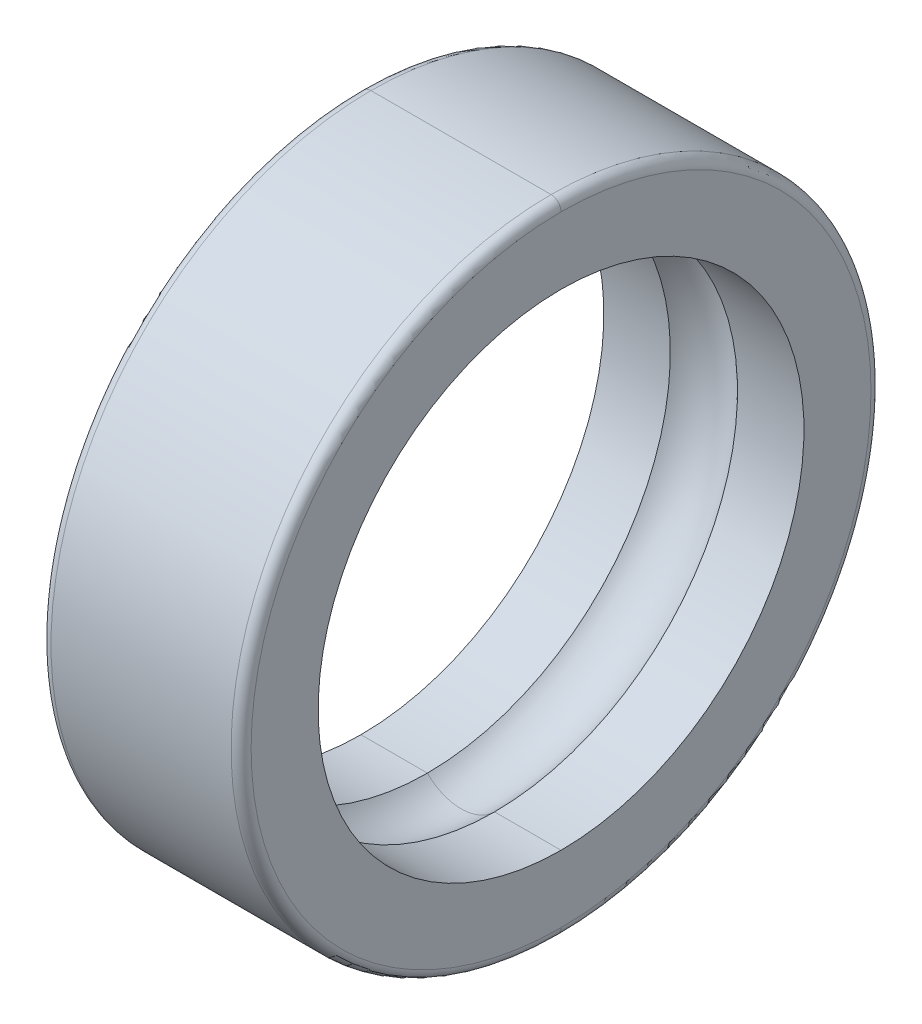
ISO-10303-21;
HEADER;
FILE_DESCRIPTION(('STEP AP214'),'2;1');
FILE_NAME('part.step','',(''),(''),'','','');
FILE_SCHEMA(('AUTOMOTIVE_DESIGN { 1 0 10303 214 1 1 1 1 }'));
ENDSEC;
DATA;
#1=APPLICATION_CONTEXT('core data for automotive mechanical design processes');
#2=APPLICATION_PROTOCOL_DEFINITION('international standard','automotive_design',2000,#1);
#3=PRODUCT_CONTEXT('',#1,'mechanical');
#4=PRODUCT('Part','Part','',(#3));
#5=PRODUCT_RELATED_PRODUCT_CATEGORY('part','',(#4));
#6=PRODUCT_DEFINITION_FORMATION('','',#4);
#7=PRODUCT_DEFINITION_CONTEXT('part definition',#1,'design');
#8=PRODUCT_DEFINITION('design','',#6,#7);
#9=PRODUCT_DEFINITION_SHAPE('','',#8);
#10=(LENGTH_UNIT() NAMED_UNIT(*) SI_UNIT(.MILLI.,.METRE.));
#11=(NAMED_UNIT(*) PLANE_ANGLE_UNIT() SI_UNIT($,.RADIAN.));
#12=(NAMED_UNIT(*) SI_UNIT($,.STERADIAN.) SOLID_ANGLE_UNIT());
#13=UNCERTAINTY_MEASURE_WITH_UNIT(LENGTH_MEASURE(1.E-05),#10,'distance_accuracy_value','');
#14=(GEOMETRIC_REPRESENTATION_CONTEXT(3) GLOBAL_UNCERTAINTY_ASSIGNED_CONTEXT((#13)) GLOBAL_UNIT_ASSIGNED_CONTEXT((#10,
#11,#12)) REPRESENTATION_CONTEXT('',''));
#15=CARTESIAN_POINT('',(0.,0.,0.));
#16=DIRECTION('',(0.,0.,1.));
#17=DIRECTION('',(1.,0.,0.));
#18=AXIS2_PLACEMENT_3D('',#15,#16,#17);
#19=CARTESIAN_POINT('',(-2.75209,0.,0.));
#20=DIRECTION('',(1.,0.,0.));
#21=DIRECTION('',(0.,-1.,0.));
#22=AXIS2_PLACEMENT_3D('',#19,#20,#21);
#23=CYLINDRICAL_SURFACE('',#22,6.0745751);
#24=CARTESIAN_POINT('',(2.5019,0.,0.));
#25=DIRECTION('',(1.,0.,0.));
#26=DIRECTION('',(0.,1.,0.));
#27=AXIS2_PLACEMENT_3D('',#24,#25,#26);
#28=CIRCLE('',#27,6.0745751);
#29=CARTESIAN_POINT('',(2.5019,6.0745751,0.));
#30=VERTEX_POINT('',#29);
#31=CARTESIAN_POINT('',(2.5019,-6.0745751,0.));
#32=VERTEX_POINT('',#31);
#33=EDGE_CURVE('E98',#30,#32,#28,.T.);
#34=ORIENTED_EDGE('',*,*,#33,.T.);
#35=DIRECTION('',(1.,0.,0.));
#36=VECTOR('',#35,1.);
#37=CARTESIAN_POINT('',(0.839755569912454,-6.0745751,0.));
#38=LINE('',#37,#36);
#39=CARTESIAN_POINT('',(0.839755569912454,-6.0745751,0.));
#40=VERTEX_POINT('',#39);
#41=EDGE_CURVE('E11',#40,#32,#38,.T.);
#42=ORIENTED_EDGE('',*,*,#41,.F.);
#43=CARTESIAN_POINT('',(0.839755569912455,0.,0.));
#44=DIRECTION('',(1.,0.,0.));
#45=DIRECTION('',(0.,1.,0.));
#46=AXIS2_PLACEMENT_3D('',#43,#44,#45);
#47=CIRCLE('',#46,6.0745751);
#48=CARTESIAN_POINT('',(0.839755569912454,6.0745751,0.));
#49=VERTEX_POINT('',#48);
#50=EDGE_CURVE('E20',#49,#40,#47,.T.);
#51=ORIENTED_EDGE('',*,*,#50,.F.);
#52=DIRECTION('',(1.,0.,0.));
#53=VECTOR('',#52,1.);
#54=CARTESIAN_POINT('',(0.839755569912454,6.0745751,0.));
#55=LINE('',#54,#53);
#56=EDGE_CURVE('E25',#49,#30,#55,.T.);
#57=ORIENTED_EDGE('',*,*,#56,.T.);
#58=EDGE_LOOP('',(#34,#42,#51,#57));
#59=FACE_BOUND('',#58,.T.);
#60=ADVANCED_FACE('F17',(#59),#23,.F.);
#61=CARTESIAN_POINT('',(-2.75209,0.,0.));
#62=DIRECTION('',(1.,0.,0.));
#63=DIRECTION('',(0.,-1.,0.));
#64=AXIS2_PLACEMENT_3D('',#61,#62,#63);
#65=CYLINDRICAL_SURFACE('',#64,6.0745751);
#66=CARTESIAN_POINT('',(0.839755569912455,0.,0.));
#67=DIRECTION('',(-1.,0.,0.));
#68=DIRECTION('',(0.,1.,0.));
#69=AXIS2_PLACEMENT_3D('',#66,#67,#68);
#70=CIRCLE('',#69,6.0745751);
#71=EDGE_CURVE('E94',#49,#40,#70,.T.);
#72=ORIENTED_EDGE('',*,*,#71,.T.);
#73=ORIENTED_EDGE('',*,*,#41,.T.);
#74=CARTESIAN_POINT('',(2.5019,0.,0.));
#75=DIRECTION('',(-1.,0.,0.));
#76=DIRECTION('',(0.,1.,0.));
#77=AXIS2_PLACEMENT_3D('',#74,#75,#76);
#78=CIRCLE('',#77,6.0745751);
#79=EDGE_CURVE('E96',#30,#32,#78,.T.);
#80=ORIENTED_EDGE('',*,*,#79,.F.);
#81=ORIENTED_EDGE('',*,*,#56,.F.);
#82=EDGE_LOOP('',(#72,#73,#80,#81));
#83=FACE_BOUND('',#82,.T.);
#84=ADVANCED_FACE('F92',(#83),#65,.F.);
#85=CARTESIAN_POINT('',(2.5019,0.,0.));
#86=DIRECTION('',(1.,0.,0.));
#87=DIRECTION('',(0.,-1.,0.));
#88=AXIS2_PLACEMENT_3D('',#85,#86,#87);
#89=PLANE('',#88);
#90=ORIENTED_EDGE('',*,*,#33,.F.);
#91=ORIENTED_EDGE('',*,*,#79,.T.);
#92=EDGE_LOOP('',(#90,#91));
#93=FACE_BOUND('',#92,.T.);
#94=CARTESIAN_POINT('',(2.5019,0.,0.));
#95=DIRECTION('',(-1.,0.,0.));
#96=DIRECTION('',(0.,1.,0.));
#97=AXIS2_PLACEMENT_3D('',#94,#95,#96);
#98=CIRCLE('',#97,7.75081);
#99=CARTESIAN_POINT('',(2.5019,7.75081,0.));
#100=VERTEX_POINT('',#99);
#101=CARTESIAN_POINT('',(2.5019,-7.75081,0.));
#102=VERTEX_POINT('',#101);
#103=EDGE_CURVE('E116',#100,#102,#98,.T.);
#104=ORIENTED_EDGE('',*,*,#103,.F.);
#105=CARTESIAN_POINT('',(2.5019,0.,0.));
#106=DIRECTION('',(1.,0.,0.));
#107=DIRECTION('',(0.,1.,0.));
#108=AXIS2_PLACEMENT_3D('',#105,#106,#107);
#109=CIRCLE('',#108,7.75081);
#110=EDGE_CURVE('E114',#100,#102,#109,.T.);
#111=ORIENTED_EDGE('',*,*,#110,.T.);
#112=EDGE_LOOP('',(#104,#111));
#113=FACE_BOUND('',#112,.T.);
#114=ADVANCED_FACE('F175',(#93,#113),#89,.T.);
#115=CARTESIAN_POINT('',(2.25171,0.,0.));
#116=DIRECTION('',(1.,0.,0.));
#117=DIRECTION('',(0.,-1.,0.));
#118=AXIS2_PLACEMENT_3D('',#115,#116,#117);
#119=TOROIDAL_SURFACE('',#118,7.75081,0.25019);
#120=CARTESIAN_POINT('',(2.25171,0.,0.));
#121=DIRECTION('',(1.,0.,0.));
#122=DIRECTION('',(0.,1.,0.));
#123=AXIS2_PLACEMENT_3D('',#120,#121,#122);
#124=CIRCLE('',#123,8.001);
#125=CARTESIAN_POINT('',(2.25171,8.001,0.));
#126=VERTEX_POINT('',#125);
#127=CARTESIAN_POINT('',(2.25171,-8.001,0.));
#128=VERTEX_POINT('',#127);
#129=EDGE_CURVE('E129',#126,#128,#124,.T.);
#130=ORIENTED_EDGE('',*,*,#129,.T.);
#131=CARTESIAN_POINT('',(2.25171,-7.75081,0.));
#132=DIRECTION('',(0.,0.,-1.));
#133=DIRECTION('',(1.,0.,0.));
#134=AXIS2_PLACEMENT_3D('',#131,#132,#133);
#135=CIRCLE('',#134,0.25019);
#136=EDGE_CURVE('E119',#102,#128,#135,.T.);
#137=ORIENTED_EDGE('',*,*,#136,.F.);
#138=ORIENTED_EDGE('',*,*,#110,.F.);
#139=CARTESIAN_POINT('',(2.25171,7.75081,0.));
#140=DIRECTION('',(0.,0.,1.));
#141=DIRECTION('',(1.,0.,0.));
#142=AXIS2_PLACEMENT_3D('',#139,#140,#141);
#143=CIRCLE('',#142,0.25019);
#144=EDGE_CURVE('E122',#100,#126,#143,.T.);
#145=ORIENTED_EDGE('',*,*,#144,.T.);
#146=EDGE_LOOP('',(#130,#137,#138,#145));
#147=FACE_BOUND('',#146,.T.);
#148=ADVANCED_FACE('F179',(#147),#119,.T.);
#149=CARTESIAN_POINT('',(2.25171,0.,0.));
#150=DIRECTION('',(1.,0.,0.));
#151=DIRECTION('',(0.,-1.,0.));
#152=AXIS2_PLACEMENT_3D('',#149,#150,#151);
#153=TOROIDAL_SURFACE('',#152,7.75081,0.25019);
#154=ORIENTED_EDGE('',*,*,#103,.T.);
#155=ORIENTED_EDGE('',*,*,#136,.T.);
#156=CARTESIAN_POINT('',(2.25171,0.,0.));
#157=DIRECTION('',(-1.,0.,0.));
#158=DIRECTION('',(0.,1.,0.));
#159=AXIS2_PLACEMENT_3D('',#156,#157,#158);
#160=CIRCLE('',#159,8.001);
#161=EDGE_CURVE('E124',#126,#128,#160,.T.);
#162=ORIENTED_EDGE('',*,*,#161,.F.);
#163=ORIENTED_EDGE('',*,*,#144,.F.);
#164=EDGE_LOOP('',(#154,#155,#162,#163));
#165=FACE_BOUND('',#164,.T.);
#166=ADVANCED_FACE('F185',(#165),#153,.T.);
#167=CARTESIAN_POINT('',(-2.75209,0.,0.));
#168=DIRECTION('',(1.,0.,0.));
#169=DIRECTION('',(0.,-1.,0.));
#170=AXIS2_PLACEMENT_3D('',#167,#168,#169);
#171=CYLINDRICAL_SURFACE('',#170,8.001);
#172=ORIENTED_EDGE('',*,*,#161,.T.);
#173=DIRECTION('',(-1.,0.,0.));
#174=VECTOR('',#173,1.);
#175=CARTESIAN_POINT('',(2.25171,-8.001,0.));
#176=LINE('',#175,#174);
#177=CARTESIAN_POINT('',(-2.25171,-8.001,0.));
#178=VERTEX_POINT('',#177);
#179=EDGE_CURVE('E127',#128,#178,#176,.T.);
#180=ORIENTED_EDGE('',*,*,#179,.T.);
#181=CARTESIAN_POINT('',(-2.25171,0.,0.));
#182=DIRECTION('',(-1.,0.,0.));
#183=DIRECTION('',(0.,1.,0.));
#184=AXIS2_PLACEMENT_3D('',#181,#182,#183);
#185=CIRCLE('',#184,8.001);
#186=CARTESIAN_POINT('',(-2.25171,8.001,0.));
#187=VERTEX_POINT('',#186);
#188=EDGE_CURVE('E137',#187,#178,#185,.T.);
#189=ORIENTED_EDGE('',*,*,#188,.F.);
#190=DIRECTION('',(-1.,0.,0.));
#191=VECTOR('',#190,1.);
#192=CARTESIAN_POINT('',(2.25171,8.001,0.));
#193=LINE('',#192,#191);
#194=EDGE_CURVE('E130',#126,#187,#193,.T.);
#195=ORIENTED_EDGE('',*,*,#194,.F.);
#196=EDGE_LOOP('',(#172,#180,#189,#195));
#197=FACE_BOUND('',#196,.T.);
#198=ADVANCED_FACE('F189',(#197),#171,.T.);
#199=CARTESIAN_POINT('',(-2.75209,0.,0.));
#200=DIRECTION('',(1.,0.,0.));
#201=DIRECTION('',(0.,-1.,0.));
#202=AXIS2_PLACEMENT_3D('',#199,#200,#201);
#203=CYLINDRICAL_SURFACE('',#202,8.001);
#204=CARTESIAN_POINT('',(-2.25171,0.,0.));
#205=DIRECTION('',(1.,0.,0.));
#206=DIRECTION('',(0.,1.,0.));
#207=AXIS2_PLACEMENT_3D('',#204,#205,#206);
#208=CIRCLE('',#207,8.001);
#209=EDGE_CURVE('E133',#187,#178,#208,.T.);
#210=ORIENTED_EDGE('',*,*,#209,.T.);
#211=ORIENTED_EDGE('',*,*,#179,.F.);
#212=ORIENTED_EDGE('',*,*,#129,.F.);
#213=ORIENTED_EDGE('',*,*,#194,.T.);
#214=EDGE_LOOP('',(#210,#211,#212,#213));
#215=FACE_BOUND('',#214,.T.);
#216=ADVANCED_FACE('F193',(#215),#203,.T.);
#217=CARTESIAN_POINT('',(-2.25171,0.,0.));
#218=DIRECTION('',(1.,0.,0.));
#219=DIRECTION('',(0.,-1.,0.));
#220=AXIS2_PLACEMENT_3D('',#217,#218,#219);
#221=TOROIDAL_SURFACE('',#220,7.75081,0.25019);
#222=CARTESIAN_POINT('',(-2.5019,0.,0.));
#223=DIRECTION('',(1.,0.,0.));
#224=DIRECTION('',(0.,1.,0.));
#225=AXIS2_PLACEMENT_3D('',#222,#223,#224);
#226=CIRCLE('',#225,7.75081);
#227=CARTESIAN_POINT('',(-2.5019,7.75081,0.));
#228=VERTEX_POINT('',#227);
#229=CARTESIAN_POINT('',(-2.5019,-7.75081,0.));
#230=VERTEX_POINT('',#229);
#231=EDGE_CURVE('E145',#228,#230,#226,.T.);
#232=ORIENTED_EDGE('',*,*,#231,.T.);
#233=CARTESIAN_POINT('',(-2.25171,-7.75081,0.));
#234=DIRECTION('',(0.,0.,-1.));
#235=DIRECTION('',(0.,-1.,0.));
#236=AXIS2_PLACEMENT_3D('',#233,#234,#235);
#237=CIRCLE('',#236,0.25019);
#238=EDGE_CURVE('E140',#178,#230,#237,.T.);
#239=ORIENTED_EDGE('',*,*,#238,.F.);
#240=ORIENTED_EDGE('',*,*,#209,.F.);
#241=CARTESIAN_POINT('',(-2.25171,7.75081,0.));
#242=DIRECTION('',(0.,0.,1.));
#243=DIRECTION('',(0.,1.,0.));
#244=AXIS2_PLACEMENT_3D('',#241,#242,#243);
#245=CIRCLE('',#244,0.25019);
#246=EDGE_CURVE('E143',#187,#228,#245,.T.);
#247=ORIENTED_EDGE('',*,*,#246,.T.);
#248=EDGE_LOOP('',(#232,#239,#240,#247));
#249=FACE_BOUND('',#248,.T.);
#250=ADVANCED_FACE('F197',(#249),#221,.T.);
#251=CARTESIAN_POINT('',(-2.25171,0.,0.));
#252=DIRECTION('',(1.,0.,0.));
#253=DIRECTION('',(0.,-1.,0.));
#254=AXIS2_PLACEMENT_3D('',#251,#252,#253);
#255=TOROIDAL_SURFACE('',#254,7.75081,0.25019);
#256=ORIENTED_EDGE('',*,*,#188,.T.);
#257=ORIENTED_EDGE('',*,*,#238,.T.);
#258=CARTESIAN_POINT('',(-2.5019,0.,0.));
#259=DIRECTION('',(-1.,0.,0.));
#260=DIRECTION('',(0.,1.,0.));
#261=AXIS2_PLACEMENT_3D('',#258,#259,#260);
#262=CIRCLE('',#261,7.75081);
#263=EDGE_CURVE('E147',#228,#230,#262,.T.);
#264=ORIENTED_EDGE('',*,*,#263,.F.);
#265=ORIENTED_EDGE('',*,*,#246,.F.);
#266=EDGE_LOOP('',(#256,#257,#264,#265));
#267=FACE_BOUND('',#266,.T.);
#268=ADVANCED_FACE('F201',(#267),#255,.T.);
#269=CARTESIAN_POINT('',(-2.5019,0.,0.));
#270=DIRECTION('',(1.,0.,0.));
#271=DIRECTION('',(0.,-1.,0.));
#272=AXIS2_PLACEMENT_3D('',#269,#270,#271);
#273=PLANE('',#272);
#274=CARTESIAN_POINT('',(-2.5019,0.,0.));
#275=DIRECTION('',(-1.,0.,0.));
#276=DIRECTION('',(0.,1.,0.));
#277=AXIS2_PLACEMENT_3D('',#274,#275,#276);
#278=CIRCLE('',#277,6.0745751);
#279=CARTESIAN_POINT('',(-2.5019,6.0745751,0.));
#280=VERTEX_POINT('',#279);
#281=CARTESIAN_POINT('',(-2.5019,-6.0745751,0.));
#282=VERTEX_POINT('',#281);
#283=EDGE_CURVE('E150',#280,#282,#278,.T.);
#284=ORIENTED_EDGE('',*,*,#283,.F.);
#285=CARTESIAN_POINT('',(-2.5019,0.,0.));
#286=DIRECTION('',(1.,0.,0.));
#287=DIRECTION('',(0.,1.,0.));
#288=AXIS2_PLACEMENT_3D('',#285,#286,#287);
#289=CIRCLE('',#288,6.0745751);
#290=EDGE_CURVE('E40',#280,#282,#289,.T.);
#291=ORIENTED_EDGE('',*,*,#290,.T.);
#292=EDGE_LOOP('',(#284,#291));
#293=FACE_BOUND('',#292,.T.);
#294=ORIENTED_EDGE('',*,*,#231,.F.);
#295=ORIENTED_EDGE('',*,*,#263,.T.);
#296=EDGE_LOOP('',(#294,#295));
#297=FACE_BOUND('',#296,.T.);
#298=ADVANCED_FACE('F169',(#293,#297),#273,.F.);
#299=CARTESIAN_POINT('',(-2.75209,0.,0.));
#300=DIRECTION('',(1.,0.,0.));
#301=DIRECTION('',(0.,-1.,0.));
#302=AXIS2_PLACEMENT_3D('',#299,#300,#301);
#303=CYLINDRICAL_SURFACE('',#302,6.0745751);
#304=ORIENTED_EDGE('',*,*,#283,.T.);
#305=DIRECTION('',(1.,0.,0.));
#306=VECTOR('',#305,1.);
#307=CARTESIAN_POINT('',(-2.5019,-6.0745751,0.));
#308=LINE('',#307,#306);
#309=CARTESIAN_POINT('',(-0.839755569912454,-6.0745751,0.));
#310=VERTEX_POINT('',#309);
#311=EDGE_CURVE('E33',#282,#310,#308,.T.);
#312=ORIENTED_EDGE('',*,*,#311,.T.);
#313=CARTESIAN_POINT('',(-0.839755569912454,0.,0.));
#314=DIRECTION('',(-1.,0.,0.));
#315=DIRECTION('',(0.,1.,0.));
#316=AXIS2_PLACEMENT_3D('',#313,#314,#315);
#317=CIRCLE('',#316,6.0745751);
#318=CARTESIAN_POINT('',(-0.839755569912454,6.0745751,0.));
#319=VERTEX_POINT('',#318);
#320=EDGE_CURVE('E109',#319,#310,#317,.T.);
#321=ORIENTED_EDGE('',*,*,#320,.F.);
#322=DIRECTION('',(1.,0.,0.));
#323=VECTOR('',#322,1.);
#324=CARTESIAN_POINT('',(-2.5019,6.0745751,0.));
#325=LINE('',#324,#323);
#326=EDGE_CURVE('E89',#280,#319,#325,.T.);
#327=ORIENTED_EDGE('',*,*,#326,.F.);
#328=EDGE_LOOP('',(#304,#312,#321,#327));
#329=FACE_BOUND('',#328,.T.);
#330=ADVANCED_FACE('F158',(#329),#303,.F.);
#331=CARTESIAN_POINT('',(-2.75209,0.,0.));
#332=DIRECTION('',(1.,0.,0.));
#333=DIRECTION('',(0.,-1.,0.));
#334=AXIS2_PLACEMENT_3D('',#331,#332,#333);
#335=CYLINDRICAL_SURFACE('',#334,6.0745751);
#336=CARTESIAN_POINT('',(-0.839755569912454,0.,0.));
#337=DIRECTION('',(1.,0.,0.));
#338=DIRECTION('',(0.,1.,0.));
#339=AXIS2_PLACEMENT_3D('',#336,#337,#338);
#340=CIRCLE('',#339,6.0745751);
#341=EDGE_CURVE('E90',#319,#310,#340,.T.);
#342=ORIENTED_EDGE('',*,*,#341,.T.);
#343=ORIENTED_EDGE('',*,*,#311,.F.);
#344=ORIENTED_EDGE('',*,*,#290,.F.);
#345=ORIENTED_EDGE('',*,*,#326,.T.);
#346=EDGE_LOOP('',(#342,#343,#344,#345));
#347=FACE_BOUND('',#346,.T.);
#348=ADVANCED_FACE('F160',(#347),#335,.F.);
#349=CARTESIAN_POINT('',(0.,0.,0.));
#350=DIRECTION('',(1.,0.,0.));
#351=DIRECTION('',(0.,-1.,0.));
#352=AXIS2_PLACEMENT_3D('',#349,#350,#351);
#353=TOROIDAL_SURFACE('',#352,5.25145,1.175893);
#354=ORIENTED_EDGE('',*,*,#50,.T.);
#355=CARTESIAN_POINT('',(0.,-5.25145,0.));
#356=DIRECTION('',(0.,0.,1.));
#357=DIRECTION('',(-0.714142842854285,-0.7,0.));
#358=AXIS2_PLACEMENT_3D('',#355,#356,#357);
#359=CIRCLE('',#358,1.175893);
#360=EDGE_CURVE('E108',#310,#40,#359,.T.);
#361=ORIENTED_EDGE('',*,*,#360,.F.);
#362=ORIENTED_EDGE('',*,*,#341,.F.);
#363=CARTESIAN_POINT('',(0.,5.25145,0.));
#364=DIRECTION('',(0.,0.,-1.));
#365=DIRECTION('',(-0.714142842854285,0.7,0.));
#366=AXIS2_PLACEMENT_3D('',#363,#364,#365);
#367=CIRCLE('',#366,1.175893);
#368=EDGE_CURVE('E102',#319,#49,#367,.T.);
#369=ORIENTED_EDGE('',*,*,#368,.T.);
#370=EDGE_LOOP('',(#354,#361,#362,#369));
#371=FACE_BOUND('',#370,.T.);
#372=ADVANCED_FACE('F103',(#371),#353,.F.);
#373=CARTESIAN_POINT('',(0.,0.,0.));
#374=DIRECTION('',(1.,0.,0.));
#375=DIRECTION('',(0.,-1.,0.));
#376=AXIS2_PLACEMENT_3D('',#373,#374,#375);
#377=TOROIDAL_SURFACE('',#376,5.25145,1.175893);
#378=ORIENTED_EDGE('',*,*,#320,.T.);
#379=ORIENTED_EDGE('',*,*,#360,.T.);
#380=ORIENTED_EDGE('',*,*,#71,.F.);
#381=ORIENTED_EDGE('',*,*,#368,.F.);
#382=EDGE_LOOP('',(#378,#379,#380,#381));
#383=FACE_BOUND('',#382,.T.);
#384=ADVANCED_FACE('F107',(#383),#377,.F.);
#385=CLOSED_SHELL('',(#60,#84,#114,#148,#166,#198,#216,#250,#268,#298,#330,#348,#372,#384));
#386=MANIFOLD_SOLID_BREP('B1',#385);
#387=ADVANCED_BREP_SHAPE_REPRESENTATION('',(#18,#386),#14);
#388=SHAPE_DEFINITION_REPRESENTATION(#9,#387);
ENDSEC;
END-ISO-10303-21;
